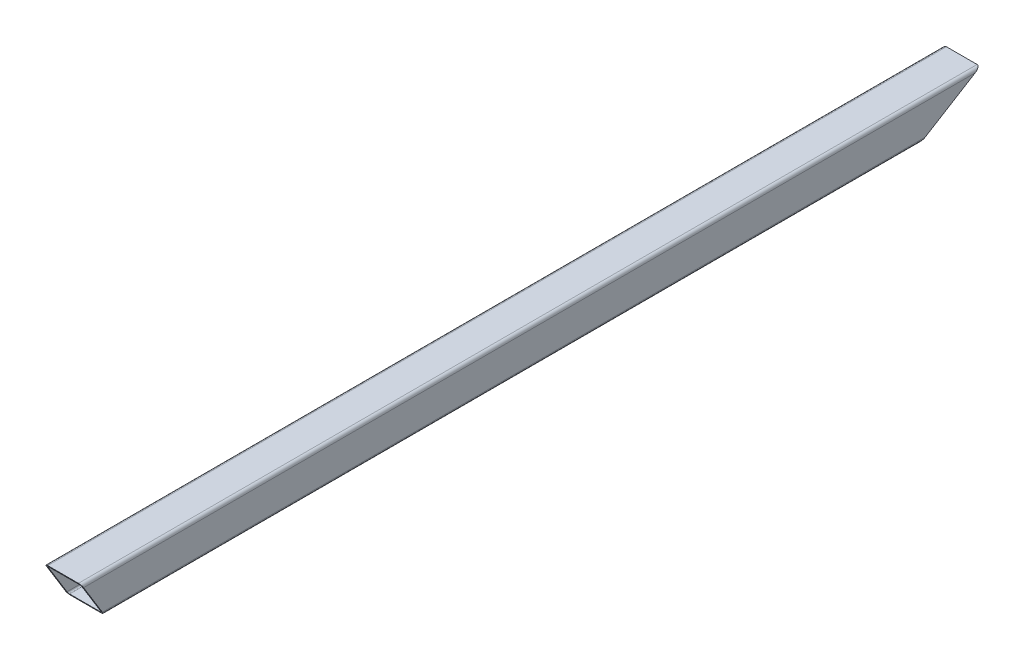
ISO-10303-21;
HEADER;
FILE_DESCRIPTION(('STEP AP214'),'2;1');
FILE_NAME('part.step','',(''),(''),'','','');
FILE_SCHEMA(('AUTOMOTIVE_DESIGN { 1 0 10303 214 1 1 1 1 }'));
ENDSEC;
DATA;
#1=APPLICATION_CONTEXT('core data for automotive mechanical design processes');
#2=APPLICATION_PROTOCOL_DEFINITION('international standard','automotive_design',2000,#1);
#3=PRODUCT_CONTEXT('',#1,'mechanical');
#4=PRODUCT('Part','Part','',(#3));
#5=PRODUCT_RELATED_PRODUCT_CATEGORY('part','',(#4));
#6=PRODUCT_DEFINITION_FORMATION('','',#4);
#7=PRODUCT_DEFINITION_CONTEXT('part definition',#1,'design');
#8=PRODUCT_DEFINITION('design','',#6,#7);
#9=PRODUCT_DEFINITION_SHAPE('','',#8);
#10=(LENGTH_UNIT() NAMED_UNIT(*) SI_UNIT(.MILLI.,.METRE.));
#11=(NAMED_UNIT(*) PLANE_ANGLE_UNIT() SI_UNIT($,.RADIAN.));
#12=(NAMED_UNIT(*) SI_UNIT($,.STERADIAN.) SOLID_ANGLE_UNIT());
#13=UNCERTAINTY_MEASURE_WITH_UNIT(LENGTH_MEASURE(1.E-05),#10,'distance_accuracy_value','');
#14=(GEOMETRIC_REPRESENTATION_CONTEXT(3) GLOBAL_UNCERTAINTY_ASSIGNED_CONTEXT((#13)) GLOBAL_UNIT_ASSIGNED_CONTEXT((#10,
#11,#12)) REPRESENTATION_CONTEXT('',''));
#15=CARTESIAN_POINT('',(0.,0.,0.));
#16=DIRECTION('',(0.,0.,1.));
#17=DIRECTION('',(1.,0.,0.));
#18=AXIS2_PLACEMENT_3D('',#15,#16,#17);
#19=CARTESIAN_POINT('',(22.6307692307692,-43.6461538461539,1700.));
#20=DIRECTION('',(0.,0.,-1.));
#21=DIRECTION('',(-1.,0.,0.));
#22=AXIS2_PLACEMENT_3D('',#19,#20,#21);
#23=CYLINDRICAL_SURFACE('',#22,6.);
#24=DIRECTION('',(0.,0.,-1.));
#25=VECTOR('',#24,1.);
#26=CARTESIAN_POINT('',(28.6307692307692,-43.6461538461538,1700.));
#27=LINE('',#26,#25);
#28=CARTESIAN_POINT('',(28.6307692307692,-43.6461538461538,1660.68571428571));
#29=VERTEX_POINT('',#28);
#30=CARTESIAN_POINT('',(28.6307692307692,-43.646153846154,104.228571428572));
#31=VERTEX_POINT('',#30);
#32=EDGE_CURVE('E166',#29,#31,#27,.T.);
#33=ORIENTED_EDGE('',*,*,#32,.F.);
#34=CARTESIAN_POINT('',(22.6307692307692,-43.6461538461539,1660.68571428571));
#35=DIRECTION('',(0.,0.5234181058748,-0.852075986307816));
#36=DIRECTION('',(0.,-0.852075986307816,-0.5234181058748));
#37=AXIS2_PLACEMENT_3D('',#34,#35,#36);
#38=ELLIPSE('',#37,7.04162550807115,6.);
#39=CARTESIAN_POINT('',(22.6307692307692,-49.6461538461539,1657.));
#40=VERTEX_POINT('',#39);
#41=EDGE_CURVE('E149',#29,#40,#38,.T.);
#42=ORIENTED_EDGE('',*,*,#41,.T.);
#43=DIRECTION('',(0.,0.,-1.));
#44=VECTOR('',#43,1.);
#45=CARTESIAN_POINT('',(22.6307692307692,-49.6461538461538,1700.));
#46=LINE('',#45,#44);
#47=CARTESIAN_POINT('',(22.6307692307692,-49.6461538461538,114.));
#48=VERTEX_POINT('',#47);
#49=EDGE_CURVE('E198',#40,#48,#46,.T.);
#50=ORIENTED_EDGE('',*,*,#49,.T.);
#51=CARTESIAN_POINT('',(22.6307692307692,-43.6461538461539,104.228571428572));
#52=DIRECTION('',(0.,0.852171225719148,0.523263033336319));
#53=DIRECTION('',(0.,0.523263033336319,-0.852171225719148));
#54=AXIS2_PLACEMENT_3D('',#51,#52,#53);
#55=ELLIPSE('',#54,11.4665084627593,6.);
#56=EDGE_CURVE('E173',#48,#31,#55,.T.);
#57=ORIENTED_EDGE('',*,*,#56,.T.);
#58=EDGE_LOOP('',(#33,#42,#50,#57));
#59=FACE_BOUND('',#58,.T.);
#60=ADVANCED_FACE('F39',(#59),#23,.T.);
#61=CARTESIAN_POINT('',(28.6307692307692,14.3538461538461,1700.));
#62=DIRECTION('',(-1.,0.,0.));
#63=DIRECTION('',(0.,-1.,0.));
#64=AXIS2_PLACEMENT_3D('',#61,#62,#63);
#65=PLANE('',#64);
#66=DIRECTION('',(0.,0.,-1.));
#67=VECTOR('',#66,1.);
#68=CARTESIAN_POINT('',(28.6307692307692,14.3538461538461,1700.));
#69=LINE('',#68,#67);
#70=CARTESIAN_POINT('',(28.6307692307692,14.3538461538462,1696.31428571429));
#71=VERTEX_POINT('',#70);
#72=CARTESIAN_POINT('',(28.6307692307692,14.3538461538462,9.77142857142838));
#73=VERTEX_POINT('',#72);
#74=EDGE_CURVE('E168',#71,#73,#69,.T.);
#75=ORIENTED_EDGE('',*,*,#74,.F.);
#76=DIRECTION('',(0.,0.852075986307816,0.5234181058748));
#77=VECTOR('',#76,1.);
#78=CARTESIAN_POINT('',(28.6307692307692,20.3538461538462,1700.));
#79=LINE('',#78,#77);
#80=EDGE_CURVE('E152',#29,#71,#79,.T.);
#81=ORIENTED_EDGE('',*,*,#80,.F.);
#82=ORIENTED_EDGE('',*,*,#32,.T.);
#83=DIRECTION('',(0.,-0.523263033336319,0.852171225719148));
#84=VECTOR('',#83,1.);
#85=CARTESIAN_POINT('',(28.6307692307692,20.3538461538462,0.));
#86=LINE('',#85,#84);
#87=EDGE_CURVE('E159',#73,#31,#86,.T.);
#88=ORIENTED_EDGE('',*,*,#87,.F.);
#89=EDGE_LOOP('',(#75,#81,#82,#88));
#90=FACE_BOUND('',#89,.T.);
#91=ADVANCED_FACE('F164',(#90),#65,.F.);
#92=CARTESIAN_POINT('',(22.6307692307692,14.3538461538462,1700.));
#93=DIRECTION('',(0.,0.,-1.));
#94=DIRECTION('',(-1.,0.,0.));
#95=AXIS2_PLACEMENT_3D('',#92,#93,#94);
#96=CYLINDRICAL_SURFACE('',#95,6.);
#97=DIRECTION('',(0.,0.,-1.));
#98=VECTOR('',#97,1.);
#99=CARTESIAN_POINT('',(22.6307692307692,20.3538461538462,1700.));
#100=LINE('',#99,#98);
#101=CARTESIAN_POINT('',(22.6307692307692,20.3538461538462,1700.));
#102=VERTEX_POINT('',#101);
#103=CARTESIAN_POINT('',(22.6307692307692,20.3538461538462,0.));
#104=VERTEX_POINT('',#103);
#105=EDGE_CURVE('E179',#102,#104,#100,.T.);
#106=ORIENTED_EDGE('',*,*,#105,.F.);
#107=CARTESIAN_POINT('',(22.6307692307692,14.3538461538462,1696.31428571429));
#108=DIRECTION('',(0.,0.5234181058748,-0.852075986307816));
#109=DIRECTION('',(0.,-0.852075986307816,-0.5234181058748));
#110=AXIS2_PLACEMENT_3D('',#107,#108,#109);
#111=ELLIPSE('',#110,7.04162550807115,6.);
#112=EDGE_CURVE('E160',#102,#71,#111,.T.);
#113=ORIENTED_EDGE('',*,*,#112,.T.);
#114=ORIENTED_EDGE('',*,*,#74,.T.);
#115=CARTESIAN_POINT('',(22.6307692307692,14.3538461538462,9.77142857142854));
#116=DIRECTION('',(0.,0.852171225719148,0.523263033336319));
#117=DIRECTION('',(0.,0.523263033336319,-0.852171225719148));
#118=AXIS2_PLACEMENT_3D('',#115,#116,#117);
#119=ELLIPSE('',#118,11.4665084627593,6.);
#120=EDGE_CURVE('E234',#73,#104,#119,.T.);
#121=ORIENTED_EDGE('',*,*,#120,.T.);
#122=EDGE_LOOP('',(#106,#113,#114,#121));
#123=FACE_BOUND('',#122,.T.);
#124=ADVANCED_FACE('F370',(#123),#96,.T.);
#125=CARTESIAN_POINT('',(22.6307692307692,20.3538461538462,1700.));
#126=DIRECTION('',(0.,-1.,0.));
#127=DIRECTION('',(1.,0.,0.));
#128=AXIS2_PLACEMENT_3D('',#125,#126,#127);
#129=PLANE('',#128);
#130=DIRECTION('',(-1.,0.,0.));
#131=VECTOR('',#130,1.);
#132=CARTESIAN_POINT('',(22.6307692307692,20.3538461538462,0.));
#133=LINE('',#132,#131);
#134=CARTESIAN_POINT('',(-35.3692307692308,20.3538461538461,0.));
#135=VERTEX_POINT('',#134);
#136=EDGE_CURVE('E202',#104,#135,#133,.T.);
#137=ORIENTED_EDGE('',*,*,#136,.T.);
#138=DIRECTION('',(0.,0.,-1.));
#139=VECTOR('',#138,1.);
#140=CARTESIAN_POINT('',(-35.3692307692307,20.3538461538461,1700.));
#141=LINE('',#140,#139);
#142=CARTESIAN_POINT('',(-35.3692307692308,20.3538461538461,1700.));
#143=VERTEX_POINT('',#142);
#144=EDGE_CURVE('E185',#143,#135,#141,.T.);
#145=ORIENTED_EDGE('',*,*,#144,.F.);
#146=DIRECTION('',(-1.,0.,0.));
#147=VECTOR('',#146,1.);
#148=CARTESIAN_POINT('',(22.6307692307692,20.3538461538462,1700.));
#149=LINE('',#148,#147);
#150=EDGE_CURVE('E201',#102,#143,#149,.T.);
#151=ORIENTED_EDGE('',*,*,#150,.F.);
#152=ORIENTED_EDGE('',*,*,#105,.T.);
#153=EDGE_LOOP('',(#137,#145,#151,#152));
#154=FACE_BOUND('',#153,.T.);
#155=ADVANCED_FACE('F374',(#154),#129,.F.);
#156=CARTESIAN_POINT('',(-35.3692307692308,14.3538461538462,1700.));
#157=DIRECTION('',(0.,0.,-1.));
#158=DIRECTION('',(-1.,0.,0.));
#159=AXIS2_PLACEMENT_3D('',#156,#157,#158);
#160=CYLINDRICAL_SURFACE('',#159,6.);
#161=DIRECTION('',(0.,0.,-1.));
#162=VECTOR('',#161,1.);
#163=CARTESIAN_POINT('',(-41.3692307692308,14.3538461538461,1700.));
#164=LINE('',#163,#162);
#165=CARTESIAN_POINT('',(-41.3692307692308,14.3538461538461,1696.31428571429));
#166=VERTEX_POINT('',#165);
#167=CARTESIAN_POINT('',(-41.3692307692308,14.353846153846,9.77142857142876));
#168=VERTEX_POINT('',#167);
#169=EDGE_CURVE('E189',#166,#168,#164,.T.);
#170=ORIENTED_EDGE('',*,*,#169,.F.);
#171=CARTESIAN_POINT('',(-35.3692307692308,14.3538461538462,1696.31428571429));
#172=DIRECTION('',(0.,0.5234181058748,-0.852075986307816));
#173=DIRECTION('',(0.,-0.852075986307816,-0.5234181058748));
#174=AXIS2_PLACEMENT_3D('',#171,#172,#173);
#175=ELLIPSE('',#174,7.04162550807115,6.);
#176=EDGE_CURVE('E286',#166,#143,#175,.T.);
#177=ORIENTED_EDGE('',*,*,#176,.T.);
#178=ORIENTED_EDGE('',*,*,#144,.T.);
#179=CARTESIAN_POINT('',(-35.3692307692308,14.3538461538462,9.77142857142854));
#180=DIRECTION('',(0.,0.852171225719148,0.523263033336319));
#181=DIRECTION('',(0.,0.523263033336319,-0.852171225719148));
#182=AXIS2_PLACEMENT_3D('',#179,#180,#181);
#183=ELLIPSE('',#182,11.4665084627593,6.);
#184=EDGE_CURVE('E238',#135,#168,#183,.T.);
#185=ORIENTED_EDGE('',*,*,#184,.T.);
#186=EDGE_LOOP('',(#170,#177,#178,#185));
#187=FACE_BOUND('',#186,.T.);
#188=ADVANCED_FACE('F380',(#187),#160,.T.);
#189=CARTESIAN_POINT('',(-41.3692307692308,14.3538461538461,1700.));
#190=DIRECTION('',(1.,0.,0.));
#191=DIRECTION('',(0.,1.,0.));
#192=AXIS2_PLACEMENT_3D('',#189,#190,#191);
#193=PLANE('',#192);
#194=DIRECTION('',(0.,0.,-1.));
#195=VECTOR('',#194,1.);
#196=CARTESIAN_POINT('',(-41.3692307692308,-43.6461538461538,1700.));
#197=LINE('',#196,#195);
#198=CARTESIAN_POINT('',(-41.3692307692308,-43.6461538461538,1660.68571428571));
#199=VERTEX_POINT('',#198);
#200=CARTESIAN_POINT('',(-41.3692307692308,-43.6461538461538,104.228571428572));
#201=VERTEX_POINT('',#200);
#202=EDGE_CURVE('E192',#199,#201,#197,.T.);
#203=ORIENTED_EDGE('',*,*,#202,.F.);
#204=DIRECTION('',(0.,0.852075986307816,0.5234181058748));
#205=VECTOR('',#204,1.);
#206=CARTESIAN_POINT('',(-41.3692307692308,15.9976452351915,1697.32404800711));
#207=LINE('',#206,#205);
#208=EDGE_CURVE('E290',#199,#166,#207,.T.);
#209=ORIENTED_EDGE('',*,*,#208,.T.);
#210=ORIENTED_EDGE('',*,*,#169,.T.);
#211=DIRECTION('',(0.,-0.523263033336319,0.852171225719148));
#212=VECTOR('',#211,1.);
#213=CARTESIAN_POINT('',(-41.3692307692306,-739.335469894433,1237.2083147072));
#214=LINE('',#213,#212);
#215=EDGE_CURVE('E242',#168,#201,#214,.T.);
#216=ORIENTED_EDGE('',*,*,#215,.T.);
#217=EDGE_LOOP('',(#203,#209,#210,#216));
#218=FACE_BOUND('',#217,.T.);
#219=ADVANCED_FACE('F384',(#218),#193,.F.);
#220=CARTESIAN_POINT('',(-35.3692307692308,-43.6461538461539,1700.));
#221=DIRECTION('',(0.,0.,-1.));
#222=DIRECTION('',(-1.,0.,0.));
#223=AXIS2_PLACEMENT_3D('',#220,#221,#222);
#224=CYLINDRICAL_SURFACE('',#223,6.);
#225=DIRECTION('',(0.,0.,-1.));
#226=VECTOR('',#225,1.);
#227=CARTESIAN_POINT('',(-35.3692307692307,-49.6461538461539,1700.));
#228=LINE('',#227,#226);
#229=CARTESIAN_POINT('',(-35.3692307692307,-49.6461538461539,1657.));
#230=VERTEX_POINT('',#229);
#231=CARTESIAN_POINT('',(-35.3692307692308,-49.6461538461539,114.));
#232=VERTEX_POINT('',#231);
#233=EDGE_CURVE('E195',#230,#232,#228,.T.);
#234=ORIENTED_EDGE('',*,*,#233,.F.);
#235=CARTESIAN_POINT('',(-35.3692307692308,-43.6461538461539,1660.68571428571));
#236=DIRECTION('',(0.,0.5234181058748,-0.852075986307816));
#237=DIRECTION('',(0.,-0.852075986307816,-0.5234181058748));
#238=AXIS2_PLACEMENT_3D('',#235,#236,#237);
#239=ELLIPSE('',#238,7.04162550807115,6.);
#240=EDGE_CURVE('E54',#230,#199,#239,.T.);
#241=ORIENTED_EDGE('',*,*,#240,.T.);
#242=ORIENTED_EDGE('',*,*,#202,.T.);
#243=CARTESIAN_POINT('',(-35.3692307692308,-43.6461538461539,104.228571428572));
#244=DIRECTION('',(0.,0.852171225719148,0.523263033336319));
#245=DIRECTION('',(0.,0.523263033336319,-0.852171225719148));
#246=AXIS2_PLACEMENT_3D('',#243,#244,#245);
#247=ELLIPSE('',#246,11.4665084627593,6.);
#248=EDGE_CURVE('E246',#201,#232,#247,.T.);
#249=ORIENTED_EDGE('',*,*,#248,.T.);
#250=EDGE_LOOP('',(#234,#241,#242,#249));
#251=FACE_BOUND('',#250,.T.);
#252=ADVANCED_FACE('F388',(#251),#224,.T.);
#253=CARTESIAN_POINT('',(22.6307692307692,-49.6461538461538,1700.));
#254=DIRECTION('',(0.,1.,0.));
#255=DIRECTION('',(-1.,0.,0.));
#256=AXIS2_PLACEMENT_3D('',#253,#254,#255);
#257=PLANE('',#256);
#258=ORIENTED_EDGE('',*,*,#49,.F.);
#259=DIRECTION('',(1.,0.,0.));
#260=VECTOR('',#259,1.);
#261=CARTESIAN_POINT('',(-1141.36923076923,-49.646153846154,1657.));
#262=LINE('',#261,#260);
#263=EDGE_CURVE('E154',#230,#40,#262,.T.);
#264=ORIENTED_EDGE('',*,*,#263,.F.);
#265=ORIENTED_EDGE('',*,*,#233,.T.);
#266=DIRECTION('',(1.,0.,0.));
#267=VECTOR('',#266,1.);
#268=CARTESIAN_POINT('',(-1141.36923076923,-49.646153846154,114.));
#269=LINE('',#268,#267);
#270=EDGE_CURVE('E278',#232,#48,#269,.T.);
#271=ORIENTED_EDGE('',*,*,#270,.T.);
#272=EDGE_LOOP('',(#258,#264,#265,#271));
#273=FACE_BOUND('',#272,.T.);
#274=ADVANCED_FACE('F392',(#273),#257,.F.);
#275=CARTESIAN_POINT('',(22.6307692307692,-43.6461538461538,1700.));
#276=DIRECTION('',(0.,0.,-1.));
#277=DIRECTION('',(-1.,0.,0.));
#278=AXIS2_PLACEMENT_3D('',#275,#276,#277);
#279=CYLINDRICAL_SURFACE('',#278,3.);
#280=CARTESIAN_POINT('',(22.6307692307692,-43.6461538461538,1660.68571428571));
#281=DIRECTION('',(0.,0.5234181058748,-0.852075986307816));
#282=DIRECTION('',(0.,-0.852075986307816,-0.5234181058748));
#283=AXIS2_PLACEMENT_3D('',#280,#281,#282);
#284=ELLIPSE('',#283,3.52081275403558,3.);
#285=CARTESIAN_POINT('',(25.6307692307692,-43.6461538461538,1660.68571428571));
#286=VERTEX_POINT('',#285);
#287=CARTESIAN_POINT('',(22.6307692307692,-46.6461538461538,1658.84285714286));
#288=VERTEX_POINT('',#287);
#289=EDGE_CURVE('E61',#286,#288,#284,.T.);
#290=ORIENTED_EDGE('',*,*,#289,.F.);
#291=DIRECTION('',(0.,0.,-1.));
#292=VECTOR('',#291,1.);
#293=CARTESIAN_POINT('',(25.6307692307692,-43.6461538461538,1700.));
#294=LINE('',#293,#292);
#295=CARTESIAN_POINT('',(25.6307692307692,-43.6461538461538,104.228571428571));
#296=VERTEX_POINT('',#295);
#297=EDGE_CURVE('E206',#286,#296,#294,.T.);
#298=ORIENTED_EDGE('',*,*,#297,.T.);
#299=CARTESIAN_POINT('',(22.6307692307692,-43.6461538461538,104.228571428572));
#300=DIRECTION('',(0.,0.852171225719148,0.523263033336319));
#301=DIRECTION('',(0.,0.523263033336319,-0.852171225719148));
#302=AXIS2_PLACEMENT_3D('',#299,#300,#301);
#303=ELLIPSE('',#302,5.73325423137965,3.);
#304=CARTESIAN_POINT('',(22.6307692307692,-46.6461538461538,109.114285714286));
#305=VERTEX_POINT('',#304);
#306=EDGE_CURVE('E250',#305,#296,#303,.T.);
#307=ORIENTED_EDGE('',*,*,#306,.F.);
#308=DIRECTION('',(0.,0.,-1.));
#309=VECTOR('',#308,1.);
#310=CARTESIAN_POINT('',(22.6307692307692,-46.6461538461538,1700.));
#311=LINE('',#310,#309);
#312=EDGE_CURVE('E229',#288,#305,#311,.T.);
#313=ORIENTED_EDGE('',*,*,#312,.F.);
#314=EDGE_LOOP('',(#290,#298,#307,#313));
#315=FACE_BOUND('',#314,.T.);
#316=ADVANCED_FACE('F338',(#315),#279,.F.);
#317=CARTESIAN_POINT('',(25.6307692307692,14.3538461538461,1700.));
#318=DIRECTION('',(-1.,0.,0.));
#319=DIRECTION('',(0.,-1.,0.));
#320=AXIS2_PLACEMENT_3D('',#317,#318,#319);
#321=PLANE('',#320);
#322=DIRECTION('',(0.,-0.852075986307816,-0.5234181058748));
#323=VECTOR('',#322,1.);
#324=CARTESIAN_POINT('',(25.6307692307692,15.9976452351915,1697.32404800711));
#325=LINE('',#324,#323);
#326=CARTESIAN_POINT('',(25.6307692307692,14.3538461538461,1696.31428571429));
#327=VERTEX_POINT('',#326);
#328=EDGE_CURVE('E298',#327,#286,#325,.T.);
#329=ORIENTED_EDGE('',*,*,#328,.F.);
#330=DIRECTION('',(0.,0.,-1.));
#331=VECTOR('',#330,1.);
#332=CARTESIAN_POINT('',(25.6307692307692,14.3538461538461,1700.));
#333=LINE('',#332,#331);
#334=CARTESIAN_POINT('',(25.6307692307692,14.3538461538461,9.77142857142854));
#335=VERTEX_POINT('',#334);
#336=EDGE_CURVE('E211',#327,#335,#333,.T.);
#337=ORIENTED_EDGE('',*,*,#336,.T.);
#338=DIRECTION('',(0.,0.523263033336319,-0.852171225719148));
#339=VECTOR('',#338,1.);
#340=CARTESIAN_POINT('',(25.6307692307695,-739.335469894433,1237.2083147072));
#341=LINE('',#340,#339);
#342=EDGE_CURVE('E254',#296,#335,#341,.T.);
#343=ORIENTED_EDGE('',*,*,#342,.F.);
#344=ORIENTED_EDGE('',*,*,#297,.F.);
#345=EDGE_LOOP('',(#329,#337,#343,#344));
#346=FACE_BOUND('',#345,.T.);
#347=ADVANCED_FACE('F344',(#346),#321,.T.);
#348=CARTESIAN_POINT('',(22.6307692307692,14.3538461538462,1700.));
#349=DIRECTION('',(0.,0.,-1.));
#350=DIRECTION('',(-1.,0.,0.));
#351=AXIS2_PLACEMENT_3D('',#348,#349,#350);
#352=CYLINDRICAL_SURFACE('',#351,3.);
#353=CARTESIAN_POINT('',(22.6307692307692,14.3538461538462,1696.31428571429));
#354=DIRECTION('',(0.,0.5234181058748,-0.852075986307816));
#355=DIRECTION('',(0.,-0.852075986307816,-0.5234181058748));
#356=AXIS2_PLACEMENT_3D('',#353,#354,#355);
#357=ELLIPSE('',#356,3.52081275403558,3.);
#358=CARTESIAN_POINT('',(22.6307692307692,17.3538461538462,1698.15714285714));
#359=VERTEX_POINT('',#358);
#360=EDGE_CURVE('E301',#359,#327,#357,.T.);
#361=ORIENTED_EDGE('',*,*,#360,.F.);
#362=DIRECTION('',(0.,0.,-1.));
#363=VECTOR('',#362,1.);
#364=CARTESIAN_POINT('',(22.6307692307692,17.3538461538462,1700.));
#365=LINE('',#364,#363);
#366=CARTESIAN_POINT('',(22.6307692307692,17.3538461538462,4.88571428571438));
#367=VERTEX_POINT('',#366);
#368=EDGE_CURVE('E214',#359,#367,#365,.T.);
#369=ORIENTED_EDGE('',*,*,#368,.T.);
#370=CARTESIAN_POINT('',(22.6307692307692,14.3538461538462,9.77142857142854));
#371=DIRECTION('',(0.,0.852171225719148,0.523263033336319));
#372=DIRECTION('',(0.,0.523263033336319,-0.852171225719148));
#373=AXIS2_PLACEMENT_3D('',#370,#371,#372);
#374=ELLIPSE('',#373,5.73325423137965,3.);
#375=EDGE_CURVE('E258',#335,#367,#374,.T.);
#376=ORIENTED_EDGE('',*,*,#375,.F.);
#377=ORIENTED_EDGE('',*,*,#336,.F.);
#378=EDGE_LOOP('',(#361,#369,#376,#377));
#379=FACE_BOUND('',#378,.T.);
#380=ADVANCED_FACE('F348',(#379),#352,.F.);
#381=CARTESIAN_POINT('',(22.6307692307692,17.3538461538462,1700.));
#382=DIRECTION('',(0.,-1.,0.));
#383=DIRECTION('',(1.,0.,0.));
#384=AXIS2_PLACEMENT_3D('',#381,#382,#383);
#385=PLANE('',#384);
#386=DIRECTION('',(1.,0.,0.));
#387=VECTOR('',#386,1.);
#388=CARTESIAN_POINT('',(22.6307692307692,17.3538461538462,1698.15714285714));
#389=LINE('',#388,#387);
#390=CARTESIAN_POINT('',(-35.3692307692308,17.3538461538462,1698.15714285714));
#391=VERTEX_POINT('',#390);
#392=EDGE_CURVE('E304',#391,#359,#389,.T.);
#393=ORIENTED_EDGE('',*,*,#392,.F.);
#394=DIRECTION('',(0.,0.,-1.));
#395=VECTOR('',#394,1.);
#396=CARTESIAN_POINT('',(-35.3692307692308,17.3538461538462,1700.));
#397=LINE('',#396,#395);
#398=CARTESIAN_POINT('',(-35.3692307692308,17.3538461538462,4.88571428571416));
#399=VERTEX_POINT('',#398);
#400=EDGE_CURVE('E217',#391,#399,#397,.T.);
#401=ORIENTED_EDGE('',*,*,#400,.T.);
#402=DIRECTION('',(-1.,0.,0.));
#403=VECTOR('',#402,1.);
#404=CARTESIAN_POINT('',(22.6307692307692,17.3538461538462,4.88571428571438));
#405=LINE('',#404,#403);
#406=EDGE_CURVE('E262',#367,#399,#405,.T.);
#407=ORIENTED_EDGE('',*,*,#406,.F.);
#408=ORIENTED_EDGE('',*,*,#368,.F.);
#409=EDGE_LOOP('',(#393,#401,#407,#408));
#410=FACE_BOUND('',#409,.T.);
#411=ADVANCED_FACE('F354',(#410),#385,.T.);
#412=CARTESIAN_POINT('',(-35.3692307692308,14.3538461538462,1700.));
#413=DIRECTION('',(0.,0.,-1.));
#414=DIRECTION('',(-1.,0.,0.));
#415=AXIS2_PLACEMENT_3D('',#412,#413,#414);
#416=CYLINDRICAL_SURFACE('',#415,3.);
#417=CARTESIAN_POINT('',(-35.3692307692308,14.3538461538462,1696.31428571429));
#418=DIRECTION('',(0.,0.5234181058748,-0.852075986307816));
#419=DIRECTION('',(0.,-0.852075986307816,-0.5234181058748));
#420=AXIS2_PLACEMENT_3D('',#417,#418,#419);
#421=ELLIPSE('',#420,3.52081275403558,3.);
#422=CARTESIAN_POINT('',(-38.3692307692308,14.3538461538461,1696.31428571429));
#423=VERTEX_POINT('',#422);
#424=EDGE_CURVE('E307',#423,#391,#421,.T.);
#425=ORIENTED_EDGE('',*,*,#424,.F.);
#426=DIRECTION('',(0.,0.,-1.));
#427=VECTOR('',#426,1.);
#428=CARTESIAN_POINT('',(-38.3692307692308,14.3538461538461,1700.));
#429=LINE('',#428,#427);
#430=CARTESIAN_POINT('',(-38.3692307692308,14.353846153846,9.77142857142854));
#431=VERTEX_POINT('',#430);
#432=EDGE_CURVE('E220',#423,#431,#429,.T.);
#433=ORIENTED_EDGE('',*,*,#432,.T.);
#434=CARTESIAN_POINT('',(-35.3692307692308,14.3538461538462,9.77142857142854));
#435=DIRECTION('',(0.,0.852171225719148,0.523263033336319));
#436=DIRECTION('',(0.,0.523263033336319,-0.852171225719148));
#437=AXIS2_PLACEMENT_3D('',#434,#435,#436);
#438=ELLIPSE('',#437,5.73325423137965,3.);
#439=EDGE_CURVE('E266',#399,#431,#438,.T.);
#440=ORIENTED_EDGE('',*,*,#439,.F.);
#441=ORIENTED_EDGE('',*,*,#400,.F.);
#442=EDGE_LOOP('',(#425,#433,#440,#441));
#443=FACE_BOUND('',#442,.T.);
#444=ADVANCED_FACE('F357',(#443),#416,.F.);
#445=CARTESIAN_POINT('',(-38.3692307692308,14.3538461538461,1700.));
#446=DIRECTION('',(1.,0.,0.));
#447=DIRECTION('',(0.,1.,0.));
#448=AXIS2_PLACEMENT_3D('',#445,#446,#447);
#449=PLANE('',#448);
#450=DIRECTION('',(0.,0.852075986307816,0.5234181058748));
#451=VECTOR('',#450,1.);
#452=CARTESIAN_POINT('',(-38.3692307692308,15.9976452351915,1697.32404800711));
#453=LINE('',#452,#451);
#454=CARTESIAN_POINT('',(-38.3692307692308,-43.6461538461538,1660.68571428571));
#455=VERTEX_POINT('',#454);
#456=EDGE_CURVE('E310',#455,#423,#453,.T.);
#457=ORIENTED_EDGE('',*,*,#456,.F.);
#458=DIRECTION('',(0.,0.,-1.));
#459=VECTOR('',#458,1.);
#460=CARTESIAN_POINT('',(-38.3692307692308,-43.6461538461538,1700.));
#461=LINE('',#460,#459);
#462=CARTESIAN_POINT('',(-38.3692307692308,-43.6461538461538,104.228571428572));
#463=VERTEX_POINT('',#462);
#464=EDGE_CURVE('E223',#455,#463,#461,.T.);
#465=ORIENTED_EDGE('',*,*,#464,.T.);
#466=DIRECTION('',(0.,-0.523263033336319,0.852171225719148));
#467=VECTOR('',#466,1.);
#468=CARTESIAN_POINT('',(-38.3692307692305,-739.335469894433,1237.2083147072));
#469=LINE('',#468,#467);
#470=EDGE_CURVE('E270',#431,#463,#469,.T.);
#471=ORIENTED_EDGE('',*,*,#470,.F.);
#472=ORIENTED_EDGE('',*,*,#432,.F.);
#473=EDGE_LOOP('',(#457,#465,#471,#472));
#474=FACE_BOUND('',#473,.T.);
#475=ADVANCED_FACE('F325',(#474),#449,.T.);
#476=CARTESIAN_POINT('',(-35.3692307692308,-43.6461538461538,1700.));
#477=DIRECTION('',(0.,0.,-1.));
#478=DIRECTION('',(-1.,0.,0.));
#479=AXIS2_PLACEMENT_3D('',#476,#477,#478);
#480=CYLINDRICAL_SURFACE('',#479,3.);
#481=CARTESIAN_POINT('',(-35.3692307692308,-43.6461538461538,1660.68571428571));
#482=DIRECTION('',(0.,0.5234181058748,-0.852075986307816));
#483=DIRECTION('',(0.,-0.852075986307816,-0.5234181058748));
#484=AXIS2_PLACEMENT_3D('',#481,#482,#483);
#485=ELLIPSE('',#484,3.52081275403558,3.);
#486=CARTESIAN_POINT('',(-35.3692307692307,-46.6461538461538,1658.84285714286));
#487=VERTEX_POINT('',#486);
#488=EDGE_CURVE('E313',#487,#455,#485,.T.);
#489=ORIENTED_EDGE('',*,*,#488,.F.);
#490=DIRECTION('',(0.,0.,-1.));
#491=VECTOR('',#490,1.);
#492=CARTESIAN_POINT('',(-35.3692307692307,-46.6461538461538,1700.));
#493=LINE('',#492,#491);
#494=CARTESIAN_POINT('',(-35.3692307692307,-46.6461538461538,109.114285714286));
#495=VERTEX_POINT('',#494);
#496=EDGE_CURVE('E226',#487,#495,#493,.T.);
#497=ORIENTED_EDGE('',*,*,#496,.T.);
#498=CARTESIAN_POINT('',(-35.3692307692308,-43.6461538461538,104.228571428572));
#499=DIRECTION('',(0.,0.852171225719148,0.523263033336319));
#500=DIRECTION('',(0.,0.523263033336319,-0.852171225719148));
#501=AXIS2_PLACEMENT_3D('',#498,#499,#500);
#502=ELLIPSE('',#501,5.73325423137965,3.);
#503=EDGE_CURVE('E274',#463,#495,#502,.T.);
#504=ORIENTED_EDGE('',*,*,#503,.F.);
#505=ORIENTED_EDGE('',*,*,#464,.F.);
#506=EDGE_LOOP('',(#489,#497,#504,#505));
#507=FACE_BOUND('',#506,.T.);
#508=ADVANCED_FACE('F328',(#507),#480,.F.);
#509=CARTESIAN_POINT('',(22.6307692307692,-46.6461538461538,1700.));
#510=DIRECTION('',(0.,1.,0.));
#511=DIRECTION('',(-1.,0.,0.));
#512=AXIS2_PLACEMENT_3D('',#509,#510,#511);
#513=PLANE('',#512);
#514=DIRECTION('',(-1.,0.,0.));
#515=VECTOR('',#514,1.);
#516=CARTESIAN_POINT('',(22.6307692307692,-46.6461538461538,1658.84285714286));
#517=LINE('',#516,#515);
#518=EDGE_CURVE('E11',#288,#487,#517,.T.);
#519=ORIENTED_EDGE('',*,*,#518,.F.);
#520=ORIENTED_EDGE('',*,*,#312,.T.);
#521=DIRECTION('',(1.,0.,0.));
#522=VECTOR('',#521,1.);
#523=CARTESIAN_POINT('',(22.6307692307692,-46.6461538461538,109.114285714286));
#524=LINE('',#523,#522);
#525=EDGE_CURVE('E47',#495,#305,#524,.T.);
#526=ORIENTED_EDGE('',*,*,#525,.F.);
#527=ORIENTED_EDGE('',*,*,#496,.F.);
#528=EDGE_LOOP('',(#519,#520,#526,#527));
#529=FACE_BOUND('',#528,.T.);
#530=ADVANCED_FACE('F335',(#529),#513,.T.);
#531=CARTESIAN_POINT('',(-1141.36923076923,20.353846153846,0.));
#532=DIRECTION('',(0.,0.852171225719148,0.523263033336319));
#533=DIRECTION('',(0.,-0.523263033336319,0.852171225719148));
#534=AXIS2_PLACEMENT_3D('',#531,#532,#533);
#535=PLANE('',#534);
#536=ORIENTED_EDGE('',*,*,#306,.T.);
#537=ORIENTED_EDGE('',*,*,#342,.T.);
#538=ORIENTED_EDGE('',*,*,#375,.T.);
#539=ORIENTED_EDGE('',*,*,#406,.T.);
#540=ORIENTED_EDGE('',*,*,#439,.T.);
#541=ORIENTED_EDGE('',*,*,#470,.T.);
#542=ORIENTED_EDGE('',*,*,#503,.T.);
#543=ORIENTED_EDGE('',*,*,#525,.T.);
#544=EDGE_LOOP('',(#536,#537,#538,#539,#540,#541,#542,#543));
#545=FACE_BOUND('',#544,.T.);
#546=ORIENTED_EDGE('',*,*,#270,.F.);
#547=ORIENTED_EDGE('',*,*,#248,.F.);
#548=ORIENTED_EDGE('',*,*,#215,.F.);
#549=ORIENTED_EDGE('',*,*,#184,.F.);
#550=ORIENTED_EDGE('',*,*,#136,.F.);
#551=ORIENTED_EDGE('',*,*,#120,.F.);
#552=ORIENTED_EDGE('',*,*,#87,.T.);
#553=ORIENTED_EDGE('',*,*,#56,.F.);
#554=EDGE_LOOP('',(#546,#547,#548,#549,#550,#551,#552,#553));
#555=FACE_BOUND('',#554,.T.);
#556=ADVANCED_FACE('F331',(#545,#555),#535,.F.);
#557=CARTESIAN_POINT('',(-1141.36923076923,20.353846153846,1700.));
#558=DIRECTION('',(0.,0.5234181058748,-0.852075986307816));
#559=DIRECTION('',(0.,0.852075986307816,0.5234181058748));
#560=AXIS2_PLACEMENT_3D('',#557,#558,#559);
#561=PLANE('',#560);
#562=ORIENTED_EDGE('',*,*,#289,.T.);
#563=ORIENTED_EDGE('',*,*,#518,.T.);
#564=ORIENTED_EDGE('',*,*,#488,.T.);
#565=ORIENTED_EDGE('',*,*,#456,.T.);
#566=ORIENTED_EDGE('',*,*,#424,.T.);
#567=ORIENTED_EDGE('',*,*,#392,.T.);
#568=ORIENTED_EDGE('',*,*,#360,.T.);
#569=ORIENTED_EDGE('',*,*,#328,.T.);
#570=EDGE_LOOP('',(#562,#563,#564,#565,#566,#567,#568,#569));
#571=FACE_BOUND('',#570,.T.);
#572=ORIENTED_EDGE('',*,*,#80,.T.);
#573=ORIENTED_EDGE('',*,*,#112,.F.);
#574=ORIENTED_EDGE('',*,*,#150,.T.);
#575=ORIENTED_EDGE('',*,*,#176,.F.);
#576=ORIENTED_EDGE('',*,*,#208,.F.);
#577=ORIENTED_EDGE('',*,*,#240,.F.);
#578=ORIENTED_EDGE('',*,*,#263,.T.);
#579=ORIENTED_EDGE('',*,*,#41,.F.);
#580=EDGE_LOOP('',(#572,#573,#574,#575,#576,#577,#578,#579));
#581=FACE_BOUND('',#580,.T.);
#582=ADVANCED_FACE('F151',(#571,#581),#561,.F.);
#583=CLOSED_SHELL('',(#60,#91,#124,#155,#188,#219,#252,#274,#316,#347,#380,#411,#444,#475,#508,
#530,#556,#582));
#584=MANIFOLD_SOLID_BREP('B2',#583);
#585=ADVANCED_BREP_SHAPE_REPRESENTATION('',(#18,#584),#14);
#586=SHAPE_DEFINITION_REPRESENTATION(#9,#585);
ENDSEC;
END-ISO-10303-21;
